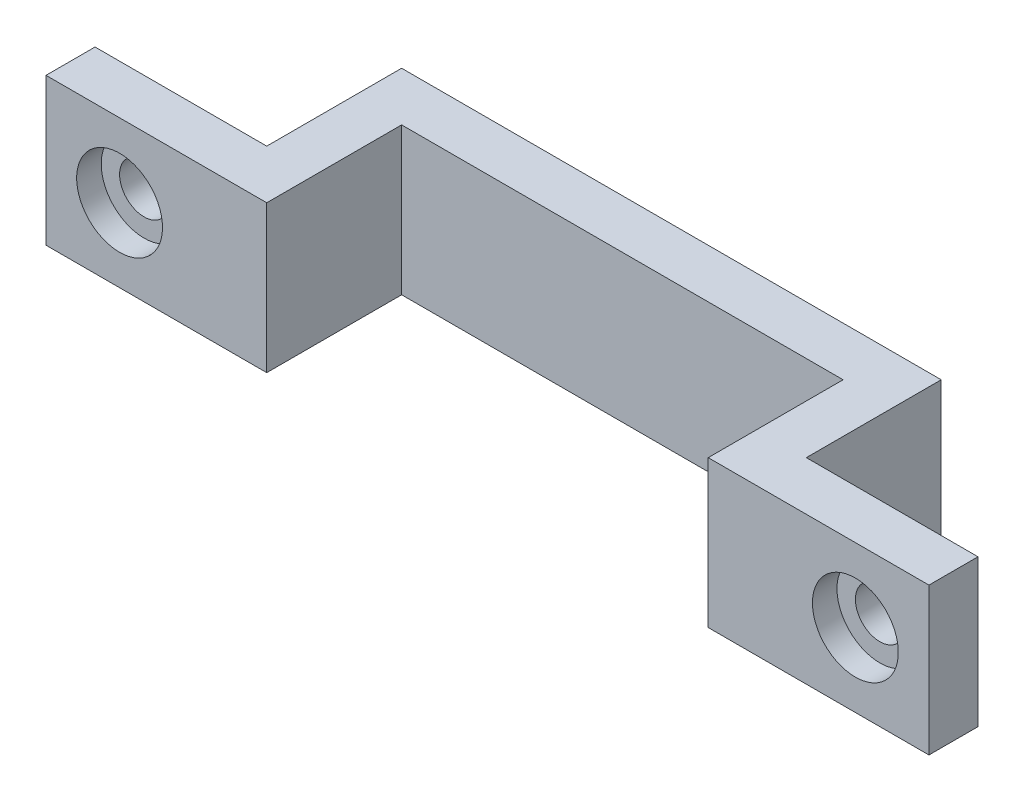
ISO-10303-21;
HEADER;
FILE_DESCRIPTION(('STEP AP214'),'2;1');
FILE_NAME('part.step','',(''),(''),'','','');
FILE_SCHEMA(('AUTOMOTIVE_DESIGN { 1 0 10303 214 1 1 1 1 }'));
ENDSEC;
DATA;
#1=APPLICATION_CONTEXT('core data for automotive mechanical design processes');
#2=APPLICATION_PROTOCOL_DEFINITION('international standard','automotive_design',2000,#1);
#3=PRODUCT_CONTEXT('',#1,'mechanical');
#4=PRODUCT('Part','Part','',(#3));
#5=PRODUCT_RELATED_PRODUCT_CATEGORY('part','',(#4));
#6=PRODUCT_DEFINITION_FORMATION('','',#4);
#7=PRODUCT_DEFINITION_CONTEXT('part definition',#1,'design');
#8=PRODUCT_DEFINITION('design','',#6,#7);
#9=PRODUCT_DEFINITION_SHAPE('','',#8);
#10=(LENGTH_UNIT() NAMED_UNIT(*) SI_UNIT(.MILLI.,.METRE.));
#11=(NAMED_UNIT(*) PLANE_ANGLE_UNIT() SI_UNIT($,.RADIAN.));
#12=(NAMED_UNIT(*) SI_UNIT($,.STERADIAN.) SOLID_ANGLE_UNIT());
#13=UNCERTAINTY_MEASURE_WITH_UNIT(LENGTH_MEASURE(1.E-05),#10,'distance_accuracy_value','');
#14=(GEOMETRIC_REPRESENTATION_CONTEXT(3) GLOBAL_UNCERTAINTY_ASSIGNED_CONTEXT((#13)) GLOBAL_UNIT_ASSIGNED_CONTEXT((#10,
#11,#12)) REPRESENTATION_CONTEXT('',''));
#15=CARTESIAN_POINT('',(0.,0.,0.));
#16=DIRECTION('',(0.,0.,1.));
#17=DIRECTION('',(1.,0.,0.));
#18=AXIS2_PLACEMENT_3D('',#15,#16,#17);
#19=CARTESIAN_POINT('',(0.,0.,4.));
#20=DIRECTION('',(0.,0.,-1.));
#21=DIRECTION('',(-1.,0.,0.));
#22=AXIS2_PLACEMENT_3D('',#19,#20,#21);
#23=PLANE('',#22);
#24=CARTESIAN_POINT('',(-30.,0.,4.));
#25=DIRECTION('',(0.,0.,1.));
#26=DIRECTION('',(1.,0.,0.));
#27=AXIS2_PLACEMENT_3D('',#24,#25,#26);
#28=CIRCLE('',#27,3.5);
#29=CARTESIAN_POINT('',(-26.5,0.,4.));
#30=VERTEX_POINT('',#29);
#31=EDGE_CURVE('E222',#30,#30,#28,.T.);
#32=ORIENTED_EDGE('',*,*,#31,.F.);
#33=EDGE_LOOP('',(#32));
#34=FACE_BOUND('',#33,.T.);
#35=DIRECTION('',(1.,0.,0.));
#36=VECTOR('',#35,1.);
#37=CARTESIAN_POINT('',(-36.,-6.,4.));
#38=LINE('',#37,#36);
#39=CARTESIAN_POINT('',(-36.,-6.,4.));
#40=VERTEX_POINT('',#39);
#41=CARTESIAN_POINT('',(-18.,-6.00000000000001,4.));
#42=VERTEX_POINT('',#41);
#43=EDGE_CURVE('E242',#40,#42,#38,.T.);
#44=ORIENTED_EDGE('',*,*,#43,.T.);
#45=DIRECTION('',(0.,-1.,0.));
#46=VECTOR('',#45,1.);
#47=CARTESIAN_POINT('',(-18.,-6.00000000000001,4.));
#48=LINE('',#47,#46);
#49=CARTESIAN_POINT('',(-18.,6.00000000000001,4.));
#50=VERTEX_POINT('',#49);
#51=EDGE_CURVE('E143',#50,#42,#48,.T.);
#52=ORIENTED_EDGE('',*,*,#51,.F.);
#53=DIRECTION('',(-1.,0.,0.));
#54=VECTOR('',#53,1.);
#55=CARTESIAN_POINT('',(-36.,6.,4.));
#56=LINE('',#55,#54);
#57=CARTESIAN_POINT('',(-36.,6.,4.));
#58=VERTEX_POINT('',#57);
#59=EDGE_CURVE('E249',#50,#58,#56,.T.);
#60=ORIENTED_EDGE('',*,*,#59,.T.);
#61=DIRECTION('',(0.,-1.,0.));
#62=VECTOR('',#61,1.);
#63=CARTESIAN_POINT('',(-36.,6.,4.));
#64=LINE('',#63,#62);
#65=EDGE_CURVE('E254',#58,#40,#64,.T.);
#66=ORIENTED_EDGE('',*,*,#65,.T.);
#67=EDGE_LOOP('',(#44,#52,#60,#66));
#68=FACE_BOUND('',#67,.T.);
#69=ADVANCED_FACE('F45',(#34,#68),#23,.F.);
#70=CARTESIAN_POINT('',(0.,0.,0.));
#71=DIRECTION('',(0.,0.,-1.));
#72=DIRECTION('',(-1.,0.,0.));
#73=AXIS2_PLACEMENT_3D('',#70,#71,#72);
#74=PLANE('',#73);
#75=DIRECTION('',(0.,-1.,0.));
#76=VECTOR('',#75,1.);
#77=CARTESIAN_POINT('',(22.,6.,0.));
#78=LINE('',#77,#76);
#79=CARTESIAN_POINT('',(22.,6.,0.));
#80=VERTEX_POINT('',#79);
#81=CARTESIAN_POINT('',(22.,-6.,0.));
#82=VERTEX_POINT('',#81);
#83=EDGE_CURVE('E71',#80,#82,#78,.T.);
#84=ORIENTED_EDGE('',*,*,#83,.F.);
#85=DIRECTION('',(-1.,0.,0.));
#86=VECTOR('',#85,1.);
#87=CARTESIAN_POINT('',(-36.,6.,0.));
#88=LINE('',#87,#86);
#89=CARTESIAN_POINT('',(36.,6.,0.));
#90=VERTEX_POINT('',#89);
#91=EDGE_CURVE('E266',#90,#80,#88,.T.);
#92=ORIENTED_EDGE('',*,*,#91,.F.);
#93=DIRECTION('',(0.,1.,0.));
#94=VECTOR('',#93,1.);
#95=CARTESIAN_POINT('',(36.,6.,0.));
#96=LINE('',#95,#94);
#97=CARTESIAN_POINT('',(36.,-6.,0.));
#98=VERTEX_POINT('',#97);
#99=EDGE_CURVE('E262',#98,#90,#96,.T.);
#100=ORIENTED_EDGE('',*,*,#99,.F.);
#101=DIRECTION('',(1.,0.,0.));
#102=VECTOR('',#101,1.);
#103=CARTESIAN_POINT('',(-36.,-6.,0.));
#104=LINE('',#103,#102);
#105=EDGE_CURVE('E241',#82,#98,#104,.T.);
#106=ORIENTED_EDGE('',*,*,#105,.F.);
#107=EDGE_LOOP('',(#84,#92,#100,#106));
#108=FACE_BOUND('',#107,.T.);
#109=CARTESIAN_POINT('',(30.,0.,0.));
#110=DIRECTION('',(0.,0.,1.));
#111=DIRECTION('',(-1.,0.,0.));
#112=AXIS2_PLACEMENT_3D('',#109,#110,#111);
#113=CIRCLE('',#112,2.);
#114=CARTESIAN_POINT('',(28.,0.,0.));
#115=VERTEX_POINT('',#114);
#116=EDGE_CURVE('E233',#115,#115,#113,.T.);
#117=ORIENTED_EDGE('',*,*,#116,.T.);
#118=EDGE_LOOP('',(#117));
#119=FACE_BOUND('',#118,.T.);
#120=ADVANCED_FACE('F307',(#108,#119),#74,.T.);
#121=CARTESIAN_POINT('',(-30.,0.,4.));
#122=DIRECTION('',(0.,0.,-1.));
#123=DIRECTION('',(-1.,0.,0.));
#124=AXIS2_PLACEMENT_3D('',#121,#122,#123);
#125=CYLINDRICAL_SURFACE('',#124,2.);
#126=CARTESIAN_POINT('',(-30.,0.,0.));
#127=DIRECTION('',(0.,0.,1.));
#128=DIRECTION('',(1.,0.,0.));
#129=AXIS2_PLACEMENT_3D('',#126,#127,#128);
#130=CIRCLE('',#129,2.);
#131=CARTESIAN_POINT('',(-28.,0.,0.));
#132=VERTEX_POINT('',#131);
#133=EDGE_CURVE('E237',#132,#132,#130,.T.);
#134=ORIENTED_EDGE('',*,*,#133,.F.);
#135=EDGE_LOOP('',(#134));
#136=FACE_BOUND('',#135,.T.);
#137=CARTESIAN_POINT('',(-30.,0.,2.));
#138=DIRECTION('',(0.,0.,1.));
#139=DIRECTION('',(1.,0.,0.));
#140=AXIS2_PLACEMENT_3D('',#137,#138,#139);
#141=CIRCLE('',#140,2.);
#142=CARTESIAN_POINT('',(-28.,0.,2.));
#143=VERTEX_POINT('',#142);
#144=EDGE_CURVE('E49',#143,#143,#141,.T.);
#145=ORIENTED_EDGE('',*,*,#144,.T.);
#146=EDGE_LOOP('',(#145));
#147=FACE_BOUND('',#146,.T.);
#148=ADVANCED_FACE('F289',(#136,#147),#125,.F.);
#149=CARTESIAN_POINT('',(30.,0.,4.));
#150=DIRECTION('',(0.,0.,1.));
#151=DIRECTION('',(-1.,0.,0.));
#152=AXIS2_PLACEMENT_3D('',#149,#150,#151);
#153=CIRCLE('',#152,3.5);
#154=CARTESIAN_POINT('',(26.5,0.,4.));
#155=VERTEX_POINT('',#154);
#156=EDGE_CURVE('E226',#155,#155,#153,.T.);
#157=ORIENTED_EDGE('',*,*,#156,.F.);
#158=EDGE_LOOP('',(#157));
#159=FACE_BOUND('',#158,.T.);
#160=CARTESIAN_POINT('',(36.,6.,4.));
#161=VERTEX_POINT('',#160);
#162=CARTESIAN_POINT('',(18.,6.00000000000001,4.));
#163=VERTEX_POINT('',#162);
#164=EDGE_CURVE('E250',#161,#163,#56,.T.);
#165=ORIENTED_EDGE('',*,*,#164,.T.);
#166=DIRECTION('',(0.,1.,0.));
#167=VECTOR('',#166,1.);
#168=CARTESIAN_POINT('',(18.,-6.00000000000001,4.));
#169=LINE('',#168,#167);
#170=CARTESIAN_POINT('',(18.,-6.00000000000001,4.));
#171=VERTEX_POINT('',#170);
#172=EDGE_CURVE('E158',#171,#163,#169,.T.);
#173=ORIENTED_EDGE('',*,*,#172,.F.);
#174=CARTESIAN_POINT('',(36.,-6.,4.));
#175=VERTEX_POINT('',#174);
#176=EDGE_CURVE('E246',#171,#175,#38,.T.);
#177=ORIENTED_EDGE('',*,*,#176,.T.);
#178=DIRECTION('',(0.,1.,0.));
#179=VECTOR('',#178,1.);
#180=CARTESIAN_POINT('',(36.,6.,4.));
#181=LINE('',#180,#179);
#182=EDGE_CURVE('E245',#175,#161,#181,.T.);
#183=ORIENTED_EDGE('',*,*,#182,.T.);
#184=EDGE_LOOP('',(#165,#173,#177,#183));
#185=FACE_BOUND('',#184,.T.);
#186=ADVANCED_FACE('F309',(#159,#185),#23,.F.);
#187=DIRECTION('',(0.,1.,0.));
#188=VECTOR('',#187,1.);
#189=CARTESIAN_POINT('',(-22.,6.,0.));
#190=LINE('',#189,#188);
#191=CARTESIAN_POINT('',(-22.,-6.,0.));
#192=VERTEX_POINT('',#191);
#193=CARTESIAN_POINT('',(-22.,6.,0.));
#194=VERTEX_POINT('',#193);
#195=EDGE_CURVE('E186',#192,#194,#190,.T.);
#196=ORIENTED_EDGE('',*,*,#195,.F.);
#197=CARTESIAN_POINT('',(-36.,-6.,0.));
#198=VERTEX_POINT('',#197);
#199=EDGE_CURVE('E258',#198,#192,#104,.T.);
#200=ORIENTED_EDGE('',*,*,#199,.F.);
#201=DIRECTION('',(0.,-1.,0.));
#202=VECTOR('',#201,1.);
#203=CARTESIAN_POINT('',(-36.,6.,0.));
#204=LINE('',#203,#202);
#205=CARTESIAN_POINT('',(-36.,6.,0.));
#206=VERTEX_POINT('',#205);
#207=EDGE_CURVE('E269',#206,#198,#204,.T.);
#208=ORIENTED_EDGE('',*,*,#207,.F.);
#209=EDGE_CURVE('E265',#194,#206,#88,.T.);
#210=ORIENTED_EDGE('',*,*,#209,.F.);
#211=EDGE_LOOP('',(#196,#200,#208,#210));
#212=FACE_BOUND('',#211,.T.);
#213=ORIENTED_EDGE('',*,*,#133,.T.);
#214=EDGE_LOOP('',(#213));
#215=FACE_BOUND('',#214,.T.);
#216=ADVANCED_FACE('F318',(#212,#215),#74,.T.);
#217=CARTESIAN_POINT('',(-36.,-6.,4.));
#218=DIRECTION('',(0.,1.,0.));
#219=DIRECTION('',(0.,0.,1.));
#220=AXIS2_PLACEMENT_3D('',#217,#218,#219);
#221=PLANE('',#220);
#222=DIRECTION('',(1.,0.,0.));
#223=VECTOR('',#222,1.);
#224=CARTESIAN_POINT('',(18.,-6.00000000000001,-7.));
#225=LINE('',#224,#223);
#226=CARTESIAN_POINT('',(-18.,-6.00000000000001,-7.));
#227=VERTEX_POINT('',#226);
#228=CARTESIAN_POINT('',(18.,-6.00000000000001,-7.));
#229=VERTEX_POINT('',#228);
#230=EDGE_CURVE('E153',#227,#229,#225,.T.);
#231=ORIENTED_EDGE('',*,*,#230,.F.);
#232=DIRECTION('',(0.,0.,1.));
#233=VECTOR('',#232,1.);
#234=CARTESIAN_POINT('',(-18.,-6.00000000000001,-7.));
#235=LINE('',#234,#233);
#236=EDGE_CURVE('E138',#227,#42,#235,.T.);
#237=ORIENTED_EDGE('',*,*,#236,.T.);
#238=ORIENTED_EDGE('',*,*,#43,.F.);
#239=DIRECTION('',(0.,0.,-1.));
#240=VECTOR('',#239,1.);
#241=CARTESIAN_POINT('',(-36.,-6.,4.));
#242=LINE('',#241,#240);
#243=EDGE_CURVE('E257',#40,#198,#242,.T.);
#244=ORIENTED_EDGE('',*,*,#243,.T.);
#245=ORIENTED_EDGE('',*,*,#199,.T.);
#246=DIRECTION('',(0.,0.,1.));
#247=VECTOR('',#246,1.);
#248=CARTESIAN_POINT('',(-22.,-6.,-11.));
#249=LINE('',#248,#247);
#250=CARTESIAN_POINT('',(-22.,-6.,-11.));
#251=VERTEX_POINT('',#250);
#252=EDGE_CURVE('E208',#251,#192,#249,.T.);
#253=ORIENTED_EDGE('',*,*,#252,.F.);
#254=DIRECTION('',(-1.,0.,0.));
#255=VECTOR('',#254,1.);
#256=CARTESIAN_POINT('',(22.,-6.,-11.));
#257=LINE('',#256,#255);
#258=CARTESIAN_POINT('',(22.,-6.,-11.));
#259=VERTEX_POINT('',#258);
#260=EDGE_CURVE('E185',#259,#251,#257,.T.);
#261=ORIENTED_EDGE('',*,*,#260,.F.);
#262=DIRECTION('',(0.,0.,1.));
#263=VECTOR('',#262,1.);
#264=CARTESIAN_POINT('',(22.,-6.,-11.));
#265=LINE('',#264,#263);
#266=EDGE_CURVE('E212',#259,#82,#265,.T.);
#267=ORIENTED_EDGE('',*,*,#266,.T.);
#268=ORIENTED_EDGE('',*,*,#105,.T.);
#269=DIRECTION('',(0.,0.,-1.));
#270=VECTOR('',#269,1.);
#271=CARTESIAN_POINT('',(36.,-6.,4.));
#272=LINE('',#271,#270);
#273=EDGE_CURVE('E11',#175,#98,#272,.T.);
#274=ORIENTED_EDGE('',*,*,#273,.F.);
#275=ORIENTED_EDGE('',*,*,#176,.F.);
#276=DIRECTION('',(0.,0.,1.));
#277=VECTOR('',#276,1.);
#278=CARTESIAN_POINT('',(18.,-6.00000000000001,-7.));
#279=LINE('',#278,#277);
#280=EDGE_CURVE('E149',#229,#171,#279,.T.);
#281=ORIENTED_EDGE('',*,*,#280,.F.);
#282=EDGE_LOOP('',(#231,#237,#238,#244,#245,#253,#261,#267,#268,#274,#275,#281));
#283=FACE_BOUND('',#282,.T.);
#284=ADVANCED_FACE('F47',(#283),#221,.F.);
#285=CARTESIAN_POINT('',(36.,6.,4.));
#286=DIRECTION('',(-1.,0.,0.));
#287=DIRECTION('',(0.,0.,1.));
#288=AXIS2_PLACEMENT_3D('',#285,#286,#287);
#289=PLANE('',#288);
#290=ORIENTED_EDGE('',*,*,#99,.T.);
#291=DIRECTION('',(0.,0.,-1.));
#292=VECTOR('',#291,1.);
#293=CARTESIAN_POINT('',(36.,6.,4.));
#294=LINE('',#293,#292);
#295=EDGE_CURVE('E55',#161,#90,#294,.T.);
#296=ORIENTED_EDGE('',*,*,#295,.F.);
#297=ORIENTED_EDGE('',*,*,#182,.F.);
#298=ORIENTED_EDGE('',*,*,#273,.T.);
#299=EDGE_LOOP('',(#290,#296,#297,#298));
#300=FACE_BOUND('',#299,.T.);
#301=ADVANCED_FACE('F365',(#300),#289,.F.);
#302=CARTESIAN_POINT('',(-36.,6.,4.));
#303=DIRECTION('',(0.,-1.,0.));
#304=DIRECTION('',(0.,0.,-1.));
#305=AXIS2_PLACEMENT_3D('',#302,#303,#304);
#306=PLANE('',#305);
#307=ORIENTED_EDGE('',*,*,#59,.F.);
#308=DIRECTION('',(0.,0.,1.));
#309=VECTOR('',#308,1.);
#310=CARTESIAN_POINT('',(-18.,6.00000000000001,-7.));
#311=LINE('',#310,#309);
#312=CARTESIAN_POINT('',(-18.,6.00000000000001,-7.));
#313=VERTEX_POINT('',#312);
#314=EDGE_CURVE('E172',#313,#50,#311,.T.);
#315=ORIENTED_EDGE('',*,*,#314,.F.);
#316=DIRECTION('',(-1.,0.,0.));
#317=VECTOR('',#316,1.);
#318=CARTESIAN_POINT('',(18.,6.00000000000001,-7.));
#319=LINE('',#318,#317);
#320=CARTESIAN_POINT('',(18.,6.,-7.));
#321=VERTEX_POINT('',#320);
#322=EDGE_CURVE('E150',#321,#313,#319,.T.);
#323=ORIENTED_EDGE('',*,*,#322,.F.);
#324=DIRECTION('',(0.,0.,1.));
#325=VECTOR('',#324,1.);
#326=CARTESIAN_POINT('',(18.,6.00000000000001,-7.));
#327=LINE('',#326,#325);
#328=EDGE_CURVE('E175',#321,#163,#327,.T.);
#329=ORIENTED_EDGE('',*,*,#328,.T.);
#330=ORIENTED_EDGE('',*,*,#164,.F.);
#331=ORIENTED_EDGE('',*,*,#295,.T.);
#332=ORIENTED_EDGE('',*,*,#91,.T.);
#333=DIRECTION('',(0.,0.,1.));
#334=VECTOR('',#333,1.);
#335=CARTESIAN_POINT('',(22.,6.,-11.));
#336=LINE('',#335,#334);
#337=CARTESIAN_POINT('',(22.,6.,-11.));
#338=VERTEX_POINT('',#337);
#339=EDGE_CURVE('E195',#338,#80,#336,.T.);
#340=ORIENTED_EDGE('',*,*,#339,.F.);
#341=DIRECTION('',(1.,0.,0.));
#342=VECTOR('',#341,1.);
#343=CARTESIAN_POINT('',(22.,6.,-11.));
#344=LINE('',#343,#342);
#345=CARTESIAN_POINT('',(-22.,6.,-11.));
#346=VERTEX_POINT('',#345);
#347=EDGE_CURVE('E192',#346,#338,#344,.T.);
#348=ORIENTED_EDGE('',*,*,#347,.F.);
#349=DIRECTION('',(0.,0.,1.));
#350=VECTOR('',#349,1.);
#351=CARTESIAN_POINT('',(-22.,6.,-11.));
#352=LINE('',#351,#350);
#353=EDGE_CURVE('E204',#346,#194,#352,.T.);
#354=ORIENTED_EDGE('',*,*,#353,.T.);
#355=ORIENTED_EDGE('',*,*,#209,.T.);
#356=DIRECTION('',(0.,0.,-1.));
#357=VECTOR('',#356,1.);
#358=CARTESIAN_POINT('',(-36.,6.,4.));
#359=LINE('',#358,#357);
#360=EDGE_CURVE('E275',#58,#206,#359,.T.);
#361=ORIENTED_EDGE('',*,*,#360,.F.);
#362=EDGE_LOOP('',(#307,#315,#323,#329,#330,#331,#332,#340,#348,#354,#355,#361));
#363=FACE_BOUND('',#362,.T.);
#364=ADVANCED_FACE('F326',(#363),#306,.F.);
#365=CARTESIAN_POINT('',(-36.,6.,4.));
#366=DIRECTION('',(1.,0.,0.));
#367=DIRECTION('',(0.,0.,-1.));
#368=AXIS2_PLACEMENT_3D('',#365,#366,#367);
#369=PLANE('',#368);
#370=ORIENTED_EDGE('',*,*,#207,.T.);
#371=ORIENTED_EDGE('',*,*,#243,.F.);
#372=ORIENTED_EDGE('',*,*,#65,.F.);
#373=ORIENTED_EDGE('',*,*,#360,.T.);
#374=EDGE_LOOP('',(#370,#371,#372,#373));
#375=FACE_BOUND('',#374,.T.);
#376=ADVANCED_FACE('F354',(#375),#369,.F.);
#377=CARTESIAN_POINT('',(30.,0.,4.));
#378=DIRECTION('',(0.,0.,-1.));
#379=DIRECTION('',(-1.,0.,0.));
#380=AXIS2_PLACEMENT_3D('',#377,#378,#379);
#381=CYLINDRICAL_SURFACE('',#380,2.);
#382=CARTESIAN_POINT('',(30.,0.,2.));
#383=DIRECTION('',(0.,0.,-1.));
#384=DIRECTION('',(-1.,0.,0.));
#385=AXIS2_PLACEMENT_3D('',#382,#383,#384);
#386=CIRCLE('',#385,2.);
#387=CARTESIAN_POINT('',(28.,0.,2.));
#388=VERTEX_POINT('',#387);
#389=EDGE_CURVE('E221',#388,#388,#386,.T.);
#390=ORIENTED_EDGE('',*,*,#389,.F.);
#391=EDGE_LOOP('',(#390));
#392=FACE_BOUND('',#391,.T.);
#393=ORIENTED_EDGE('',*,*,#116,.F.);
#394=EDGE_LOOP('',(#393));
#395=FACE_BOUND('',#394,.T.);
#396=ADVANCED_FACE('F348',(#392,#395),#381,.F.);
#397=CARTESIAN_POINT('',(30.,0.,2.));
#398=DIRECTION('',(0.,0.,1.));
#399=DIRECTION('',(1.,0.,0.));
#400=AXIS2_PLACEMENT_3D('',#397,#398,#399);
#401=CYLINDRICAL_SURFACE('',#400,3.5);
#402=CARTESIAN_POINT('',(30.,0.,2.));
#403=DIRECTION('',(0.,0.,1.));
#404=DIRECTION('',(-1.,0.,0.));
#405=AXIS2_PLACEMENT_3D('',#402,#403,#404);
#406=CIRCLE('',#405,3.5);
#407=CARTESIAN_POINT('',(26.5,0.,2.));
#408=VERTEX_POINT('',#407);
#409=EDGE_CURVE('E216',#408,#408,#406,.T.);
#410=ORIENTED_EDGE('',*,*,#409,.F.);
#411=EDGE_LOOP('',(#410));
#412=FACE_BOUND('',#411,.T.);
#413=ORIENTED_EDGE('',*,*,#156,.T.);
#414=EDGE_LOOP('',(#413));
#415=FACE_BOUND('',#414,.T.);
#416=ADVANCED_FACE('F345',(#412,#415),#401,.F.);
#417=CARTESIAN_POINT('',(30.,0.,2.));
#418=DIRECTION('',(0.,0.,-1.));
#419=DIRECTION('',(-1.,0.,0.));
#420=AXIS2_PLACEMENT_3D('',#417,#418,#419);
#421=PLANE('',#420);
#422=ORIENTED_EDGE('',*,*,#389,.T.);
#423=EDGE_LOOP('',(#422));
#424=FACE_BOUND('',#423,.T.);
#425=ORIENTED_EDGE('',*,*,#409,.T.);
#426=EDGE_LOOP('',(#425));
#427=FACE_BOUND('',#426,.T.);
#428=ADVANCED_FACE('F301',(#424,#427),#421,.F.);
#429=CARTESIAN_POINT('',(-30.,0.,2.));
#430=DIRECTION('',(0.,0.,1.));
#431=DIRECTION('',(1.,0.,0.));
#432=AXIS2_PLACEMENT_3D('',#429,#430,#431);
#433=CYLINDRICAL_SURFACE('',#432,3.5);
#434=CARTESIAN_POINT('',(-30.,0.,2.));
#435=DIRECTION('',(0.,0.,1.));
#436=DIRECTION('',(1.,0.,0.));
#437=AXIS2_PLACEMENT_3D('',#434,#435,#436);
#438=CIRCLE('',#437,3.5);
#439=CARTESIAN_POINT('',(-26.5,0.,2.));
#440=VERTEX_POINT('',#439);
#441=EDGE_CURVE('E217',#440,#440,#438,.T.);
#442=ORIENTED_EDGE('',*,*,#441,.F.);
#443=EDGE_LOOP('',(#442));
#444=FACE_BOUND('',#443,.T.);
#445=ORIENTED_EDGE('',*,*,#31,.T.);
#446=EDGE_LOOP('',(#445));
#447=FACE_BOUND('',#446,.T.);
#448=ADVANCED_FACE('F295',(#444,#447),#433,.F.);
#449=CARTESIAN_POINT('',(-30.,0.,2.));
#450=DIRECTION('',(0.,0.,1.));
#451=DIRECTION('',(1.,0.,0.));
#452=AXIS2_PLACEMENT_3D('',#449,#450,#451);
#453=PLANE('',#452);
#454=ORIENTED_EDGE('',*,*,#144,.F.);
#455=EDGE_LOOP('',(#454));
#456=FACE_BOUND('',#455,.T.);
#457=ORIENTED_EDGE('',*,*,#441,.T.);
#458=EDGE_LOOP('',(#457));
#459=FACE_BOUND('',#458,.T.);
#460=ADVANCED_FACE('F291',(#456,#459),#453,.T.);
#461=CARTESIAN_POINT('',(22.,6.,-11.));
#462=DIRECTION('',(-1.,0.,0.));
#463=DIRECTION('',(0.,0.,1.));
#464=AXIS2_PLACEMENT_3D('',#461,#462,#463);
#465=PLANE('',#464);
#466=ORIENTED_EDGE('',*,*,#83,.T.);
#467=ORIENTED_EDGE('',*,*,#266,.F.);
#468=DIRECTION('',(0.,-1.,0.));
#469=VECTOR('',#468,1.);
#470=CARTESIAN_POINT('',(22.,6.,-11.));
#471=LINE('',#470,#469);
#472=EDGE_CURVE('E181',#338,#259,#471,.T.);
#473=ORIENTED_EDGE('',*,*,#472,.F.);
#474=ORIENTED_EDGE('',*,*,#339,.T.);
#475=EDGE_LOOP('',(#466,#467,#473,#474));
#476=FACE_BOUND('',#475,.T.);
#477=ADVANCED_FACE('F294',(#476),#465,.F.);
#478=CARTESIAN_POINT('',(-22.,6.,-11.));
#479=DIRECTION('',(1.,0.,0.));
#480=DIRECTION('',(0.,0.,-1.));
#481=AXIS2_PLACEMENT_3D('',#478,#479,#480);
#482=PLANE('',#481);
#483=ORIENTED_EDGE('',*,*,#195,.T.);
#484=ORIENTED_EDGE('',*,*,#353,.F.);
#485=DIRECTION('',(0.,1.,0.));
#486=VECTOR('',#485,1.);
#487=CARTESIAN_POINT('',(-22.,6.,-11.));
#488=LINE('',#487,#486);
#489=EDGE_CURVE('E189',#251,#346,#488,.T.);
#490=ORIENTED_EDGE('',*,*,#489,.F.);
#491=ORIENTED_EDGE('',*,*,#252,.T.);
#492=EDGE_LOOP('',(#483,#484,#490,#491));
#493=FACE_BOUND('',#492,.T.);
#494=ADVANCED_FACE('F322',(#493),#482,.F.);
#495=CARTESIAN_POINT('',(0.,0.,-11.));
#496=DIRECTION('',(0.,0.,-1.));
#497=DIRECTION('',(-1.,0.,0.));
#498=AXIS2_PLACEMENT_3D('',#495,#496,#497);
#499=PLANE('',#498);
#500=ORIENTED_EDGE('',*,*,#472,.T.);
#501=ORIENTED_EDGE('',*,*,#260,.T.);
#502=ORIENTED_EDGE('',*,*,#489,.T.);
#503=ORIENTED_EDGE('',*,*,#347,.T.);
#504=EDGE_LOOP('',(#500,#501,#502,#503));
#505=FACE_BOUND('',#504,.T.);
#506=ADVANCED_FACE('F331',(#505),#499,.T.);
#507=CARTESIAN_POINT('',(-18.,-6.00000000000001,-7.));
#508=DIRECTION('',(-1.,0.,0.));
#509=DIRECTION('',(0.,0.,1.));
#510=AXIS2_PLACEMENT_3D('',#507,#508,#509);
#511=PLANE('',#510);
#512=ORIENTED_EDGE('',*,*,#51,.T.);
#513=ORIENTED_EDGE('',*,*,#236,.F.);
#514=DIRECTION('',(0.,-1.,0.));
#515=VECTOR('',#514,1.);
#516=CARTESIAN_POINT('',(-18.,-6.00000000000001,-7.));
#517=LINE('',#516,#515);
#518=EDGE_CURVE('E141',#313,#227,#517,.T.);
#519=ORIENTED_EDGE('',*,*,#518,.F.);
#520=ORIENTED_EDGE('',*,*,#314,.T.);
#521=EDGE_LOOP('',(#512,#513,#519,#520));
#522=FACE_BOUND('',#521,.T.);
#523=ADVANCED_FACE('F140',(#522),#511,.F.);
#524=CARTESIAN_POINT('',(18.,-6.00000000000001,-7.));
#525=DIRECTION('',(1.,0.,0.));
#526=DIRECTION('',(0.,0.,-1.));
#527=AXIS2_PLACEMENT_3D('',#524,#525,#526);
#528=PLANE('',#527);
#529=ORIENTED_EDGE('',*,*,#172,.T.);
#530=ORIENTED_EDGE('',*,*,#328,.F.);
#531=DIRECTION('',(0.,1.,0.));
#532=VECTOR('',#531,1.);
#533=CARTESIAN_POINT('',(18.,-6.00000000000001,-7.));
#534=LINE('',#533,#532);
#535=EDGE_CURVE('E63',#229,#321,#534,.T.);
#536=ORIENTED_EDGE('',*,*,#535,.F.);
#537=ORIENTED_EDGE('',*,*,#280,.T.);
#538=EDGE_LOOP('',(#529,#530,#536,#537));
#539=FACE_BOUND('',#538,.T.);
#540=ADVANCED_FACE('F485',(#539),#528,.F.);
#541=CARTESIAN_POINT('',(0.,0.,-7.));
#542=DIRECTION('',(0.,0.,1.));
#543=DIRECTION('',(1.,0.,0.));
#544=AXIS2_PLACEMENT_3D('',#541,#542,#543);
#545=PLANE('',#544);
#546=ORIENTED_EDGE('',*,*,#518,.T.);
#547=ORIENTED_EDGE('',*,*,#230,.T.);
#548=ORIENTED_EDGE('',*,*,#535,.T.);
#549=ORIENTED_EDGE('',*,*,#322,.T.);
#550=EDGE_LOOP('',(#546,#547,#548,#549));
#551=FACE_BOUND('',#550,.T.);
#552=ADVANCED_FACE('F152',(#551),#545,.T.);
#553=CLOSED_SHELL('',(#69,#120,#148,#186,#216,#284,#301,#364,#376,#396,#416,#428,#448,#460,#477,
#494,#506,#523,#540,#552));
#554=MANIFOLD_SOLID_BREP('B2',#553);
#555=ADVANCED_BREP_SHAPE_REPRESENTATION('',(#18,#554),#14);
#556=SHAPE_DEFINITION_REPRESENTATION(#9,#555);
ENDSEC;
END-ISO-10303-21;
